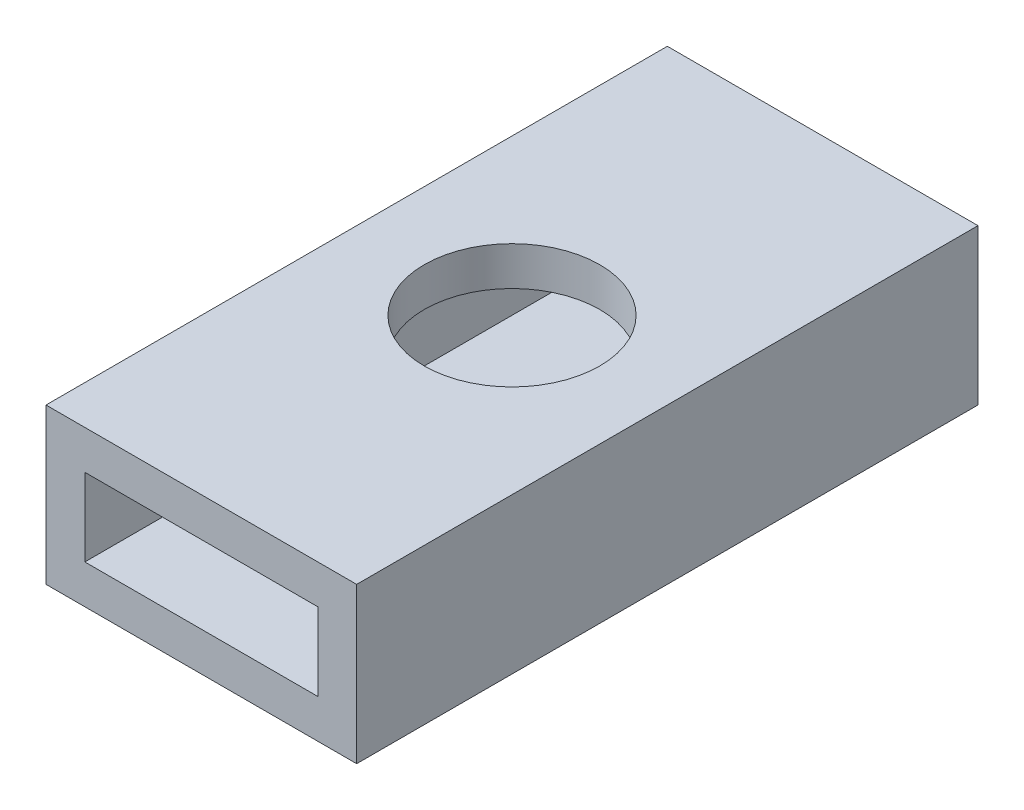
ISO-10303-21;
HEADER;
FILE_DESCRIPTION(('STEP AP214'),'2;1');
FILE_NAME('part.step','',(''),(''),'','','');
FILE_SCHEMA(('AUTOMOTIVE_DESIGN { 1 0 10303 214 1 1 1 1 }'));
ENDSEC;
DATA;
#1=APPLICATION_CONTEXT('core data for automotive mechanical design processes');
#2=APPLICATION_PROTOCOL_DEFINITION('international standard','automotive_design',2000,#1);
#3=PRODUCT_CONTEXT('',#1,'mechanical');
#4=PRODUCT('Part','Part','',(#3));
#5=PRODUCT_RELATED_PRODUCT_CATEGORY('part','',(#4));
#6=PRODUCT_DEFINITION_FORMATION('','',#4);
#7=PRODUCT_DEFINITION_CONTEXT('part definition',#1,'design');
#8=PRODUCT_DEFINITION('design','',#6,#7);
#9=PRODUCT_DEFINITION_SHAPE('','',#8);
#10=(LENGTH_UNIT() NAMED_UNIT(*) SI_UNIT(.MILLI.,.METRE.));
#11=(NAMED_UNIT(*) PLANE_ANGLE_UNIT() SI_UNIT($,.RADIAN.));
#12=(NAMED_UNIT(*) SI_UNIT($,.STERADIAN.) SOLID_ANGLE_UNIT());
#13=UNCERTAINTY_MEASURE_WITH_UNIT(LENGTH_MEASURE(1.E-05),#10,'distance_accuracy_value','');
#14=(GEOMETRIC_REPRESENTATION_CONTEXT(3) GLOBAL_UNCERTAINTY_ASSIGNED_CONTEXT((#13)) GLOBAL_UNIT_ASSIGNED_CONTEXT((#10,
#11,#12)) REPRESENTATION_CONTEXT('',''));
#15=CARTESIAN_POINT('',(0.,0.,0.));
#16=DIRECTION('',(0.,0.,1.));
#17=DIRECTION('',(1.,0.,0.));
#18=AXIS2_PLACEMENT_3D('',#15,#16,#17);
#19=CARTESIAN_POINT('',(0.,0.,101.6));
#20=DIRECTION('',(1.,0.,0.));
#21=DIRECTION('',(0.,1.,0.));
#22=AXIS2_PLACEMENT_3D('',#19,#20,#21);
#23=PLANE('',#22);
#24=DIRECTION('',(0.,-1.,0.));
#25=VECTOR('',#24,1.);
#26=CARTESIAN_POINT('',(0.,0.,0.));
#27=LINE('',#26,#25);
#28=CARTESIAN_POINT('',(0.,25.4,0.));
#29=VERTEX_POINT('',#28);
#30=CARTESIAN_POINT('',(0.,0.,0.));
#31=VERTEX_POINT('',#30);
#32=EDGE_CURVE('E150',#29,#31,#27,.T.);
#33=ORIENTED_EDGE('',*,*,#32,.T.);
#34=DIRECTION('',(0.,0.,-1.));
#35=VECTOR('',#34,1.);
#36=CARTESIAN_POINT('',(0.,0.,101.6));
#37=LINE('',#36,#35);
#38=CARTESIAN_POINT('',(0.,0.,101.6));
#39=VERTEX_POINT('',#38);
#40=EDGE_CURVE('E11',#39,#31,#37,.T.);
#41=ORIENTED_EDGE('',*,*,#40,.F.);
#42=DIRECTION('',(0.,-1.,0.));
#43=VECTOR('',#42,1.);
#44=CARTESIAN_POINT('',(0.,0.,101.6));
#45=LINE('',#44,#43);
#46=CARTESIAN_POINT('',(0.,25.4,101.6));
#47=VERTEX_POINT('',#46);
#48=EDGE_CURVE('E156',#47,#39,#45,.T.);
#49=ORIENTED_EDGE('',*,*,#48,.F.);
#50=DIRECTION('',(0.,0.,-1.));
#51=VECTOR('',#50,1.);
#52=CARTESIAN_POINT('',(0.,25.4,101.6));
#53=LINE('',#52,#51);
#54=EDGE_CURVE('E170',#47,#29,#53,.T.);
#55=ORIENTED_EDGE('',*,*,#54,.T.);
#56=EDGE_LOOP('',(#33,#41,#49,#55));
#57=FACE_BOUND('',#56,.T.);
#58=ADVANCED_FACE('F39',(#57),#23,.F.);
#59=CARTESIAN_POINT('',(0.,0.,101.6));
#60=DIRECTION('',(0.,1.,0.));
#61=DIRECTION('',(0.,0.,1.));
#62=AXIS2_PLACEMENT_3D('',#59,#60,#61);
#63=PLANE('',#62);
#64=DIRECTION('',(1.,0.,0.));
#65=VECTOR('',#64,1.);
#66=CARTESIAN_POINT('',(0.,0.,0.));
#67=LINE('',#66,#65);
#68=CARTESIAN_POINT('',(50.8,0.,0.));
#69=VERTEX_POINT('',#68);
#70=EDGE_CURVE('E174',#31,#69,#67,.T.);
#71=ORIENTED_EDGE('',*,*,#70,.T.);
#72=DIRECTION('',(0.,0.,-1.));
#73=VECTOR('',#72,1.);
#74=CARTESIAN_POINT('',(50.8,0.,101.6));
#75=LINE('',#74,#73);
#76=CARTESIAN_POINT('',(50.8,0.,101.6));
#77=VERTEX_POINT('',#76);
#78=EDGE_CURVE('E47',#77,#69,#75,.T.);
#79=ORIENTED_EDGE('',*,*,#78,.F.);
#80=DIRECTION('',(1.,0.,0.));
#81=VECTOR('',#80,1.);
#82=CARTESIAN_POINT('',(0.,0.,101.6));
#83=LINE('',#82,#81);
#84=EDGE_CURVE('E160',#39,#77,#83,.T.);
#85=ORIENTED_EDGE('',*,*,#84,.F.);
#86=ORIENTED_EDGE('',*,*,#40,.T.);
#87=EDGE_LOOP('',(#71,#79,#85,#86));
#88=FACE_BOUND('',#87,.T.);
#89=ADVANCED_FACE('F208',(#88),#63,.F.);
#90=CARTESIAN_POINT('',(50.8,0.,101.6));
#91=DIRECTION('',(-1.,0.,0.));
#92=DIRECTION('',(0.,-1.,0.));
#93=AXIS2_PLACEMENT_3D('',#90,#91,#92);
#94=PLANE('',#93);
#95=DIRECTION('',(0.,1.,0.));
#96=VECTOR('',#95,1.);
#97=CARTESIAN_POINT('',(50.8,0.,0.));
#98=LINE('',#97,#96);
#99=CARTESIAN_POINT('',(50.8,25.4,0.));
#100=VERTEX_POINT('',#99);
#101=EDGE_CURVE('E177',#69,#100,#98,.T.);
#102=ORIENTED_EDGE('',*,*,#101,.T.);
#103=DIRECTION('',(0.,0.,-1.));
#104=VECTOR('',#103,1.);
#105=CARTESIAN_POINT('',(50.8,25.4,101.6));
#106=LINE('',#105,#104);
#107=CARTESIAN_POINT('',(50.8,25.4,101.6));
#108=VERTEX_POINT('',#107);
#109=EDGE_CURVE('E185',#108,#100,#106,.T.);
#110=ORIENTED_EDGE('',*,*,#109,.F.);
#111=DIRECTION('',(0.,1.,0.));
#112=VECTOR('',#111,1.);
#113=CARTESIAN_POINT('',(50.8,0.,101.6));
#114=LINE('',#113,#112);
#115=EDGE_CURVE('E164',#77,#108,#114,.T.);
#116=ORIENTED_EDGE('',*,*,#115,.F.);
#117=ORIENTED_EDGE('',*,*,#78,.T.);
#118=EDGE_LOOP('',(#102,#110,#116,#117));
#119=FACE_BOUND('',#118,.T.);
#120=ADVANCED_FACE('F194',(#119),#94,.F.);
#121=CARTESIAN_POINT('',(0.,25.4,101.6));
#122=DIRECTION('',(0.,-1.,0.));
#123=DIRECTION('',(0.,0.,-1.));
#124=AXIS2_PLACEMENT_3D('',#121,#122,#123);
#125=PLANE('',#124);
#126=CARTESIAN_POINT('',(25.4,25.4,50.8));
#127=DIRECTION('',(0.,1.,0.));
#128=DIRECTION('',(0.,0.,1.));
#129=AXIS2_PLACEMENT_3D('',#126,#127,#128);
#130=CIRCLE('',#129,14.351);
#131=CARTESIAN_POINT('',(25.4,25.4,65.151));
#132=VERTEX_POINT('',#131);
#133=EDGE_CURVE('E243',#132,#132,#130,.T.);
#134=ORIENTED_EDGE('',*,*,#133,.F.);
#135=EDGE_LOOP('',(#134));
#136=FACE_BOUND('',#135,.T.);
#137=DIRECTION('',(-1.,0.,0.));
#138=VECTOR('',#137,1.);
#139=CARTESIAN_POINT('',(0.,25.4,0.));
#140=LINE('',#139,#138);
#141=EDGE_CURVE('E161',#100,#29,#140,.T.);
#142=ORIENTED_EDGE('',*,*,#141,.T.);
#143=ORIENTED_EDGE('',*,*,#54,.F.);
#144=DIRECTION('',(-1.,0.,0.));
#145=VECTOR('',#144,1.);
#146=CARTESIAN_POINT('',(0.,25.4,101.6));
#147=LINE('',#146,#145);
#148=EDGE_CURVE('E167',#108,#47,#147,.T.);
#149=ORIENTED_EDGE('',*,*,#148,.F.);
#150=ORIENTED_EDGE('',*,*,#109,.T.);
#151=EDGE_LOOP('',(#142,#143,#149,#150));
#152=FACE_BOUND('',#151,.T.);
#153=ADVANCED_FACE('F201',(#136,#152),#125,.F.);
#154=CARTESIAN_POINT('',(0.,0.,101.6));
#155=DIRECTION('',(0.,0.,-1.));
#156=DIRECTION('',(-1.,0.,0.));
#157=AXIS2_PLACEMENT_3D('',#154,#155,#156);
#158=PLANE('',#157);
#159=DIRECTION('',(1.,0.,0.));
#160=VECTOR('',#159,1.);
#161=CARTESIAN_POINT('',(6.35,6.35,101.6));
#162=LINE('',#161,#160);
#163=CARTESIAN_POINT('',(6.35,6.35,101.6));
#164=VERTEX_POINT('',#163);
#165=CARTESIAN_POINT('',(44.45,6.35,101.6));
#166=VERTEX_POINT('',#165);
#167=EDGE_CURVE('E141',#164,#166,#162,.T.);
#168=ORIENTED_EDGE('',*,*,#167,.F.);
#169=DIRECTION('',(0.,-1.,0.));
#170=VECTOR('',#169,1.);
#171=CARTESIAN_POINT('',(6.35,19.05,101.6));
#172=LINE('',#171,#170);
#173=CARTESIAN_POINT('',(6.35,19.05,101.6));
#174=VERTEX_POINT('',#173);
#175=EDGE_CURVE('E54',#174,#164,#172,.T.);
#176=ORIENTED_EDGE('',*,*,#175,.F.);
#177=DIRECTION('',(-1.,0.,0.));
#178=VECTOR('',#177,1.);
#179=CARTESIAN_POINT('',(6.35,19.05,101.6));
#180=LINE('',#179,#178);
#181=CARTESIAN_POINT('',(44.45,19.05,101.6));
#182=VERTEX_POINT('',#181);
#183=EDGE_CURVE('E125',#182,#174,#180,.T.);
#184=ORIENTED_EDGE('',*,*,#183,.F.);
#185=DIRECTION('',(0.,1.,0.));
#186=VECTOR('',#185,1.);
#187=CARTESIAN_POINT('',(44.45,19.05,101.6));
#188=LINE('',#187,#186);
#189=EDGE_CURVE('E129',#166,#182,#188,.T.);
#190=ORIENTED_EDGE('',*,*,#189,.F.);
#191=EDGE_LOOP('',(#168,#176,#184,#190));
#192=FACE_BOUND('',#191,.T.);
#193=ORIENTED_EDGE('',*,*,#48,.T.);
#194=ORIENTED_EDGE('',*,*,#84,.T.);
#195=ORIENTED_EDGE('',*,*,#115,.T.);
#196=ORIENTED_EDGE('',*,*,#148,.T.);
#197=EDGE_LOOP('',(#193,#194,#195,#196));
#198=FACE_BOUND('',#197,.T.);
#199=ADVANCED_FACE('F207',(#192,#198),#158,.F.);
#200=CARTESIAN_POINT('',(0.,0.,0.));
#201=DIRECTION('',(0.,0.,-1.));
#202=DIRECTION('',(-1.,0.,0.));
#203=AXIS2_PLACEMENT_3D('',#200,#201,#202);
#204=PLANE('',#203);
#205=DIRECTION('',(0.,-1.,0.));
#206=VECTOR('',#205,1.);
#207=CARTESIAN_POINT('',(6.35,19.05,0.));
#208=LINE('',#207,#206);
#209=CARTESIAN_POINT('',(6.35,19.05,0.));
#210=VERTEX_POINT('',#209);
#211=CARTESIAN_POINT('',(6.35,6.35,0.));
#212=VERTEX_POINT('',#211);
#213=EDGE_CURVE('E106',#210,#212,#208,.T.);
#214=ORIENTED_EDGE('',*,*,#213,.T.);
#215=DIRECTION('',(1.,0.,0.));
#216=VECTOR('',#215,1.);
#217=CARTESIAN_POINT('',(6.35,6.35,0.));
#218=LINE('',#217,#216);
#219=CARTESIAN_POINT('',(44.45,6.35,0.));
#220=VERTEX_POINT('',#219);
#221=EDGE_CURVE('E116',#212,#220,#218,.T.);
#222=ORIENTED_EDGE('',*,*,#221,.T.);
#223=DIRECTION('',(0.,1.,0.));
#224=VECTOR('',#223,1.);
#225=CARTESIAN_POINT('',(44.45,19.05,0.));
#226=LINE('',#225,#224);
#227=CARTESIAN_POINT('',(44.45,19.05,0.));
#228=VERTEX_POINT('',#227);
#229=EDGE_CURVE('E62',#220,#228,#226,.T.);
#230=ORIENTED_EDGE('',*,*,#229,.T.);
#231=DIRECTION('',(-1.,0.,0.));
#232=VECTOR('',#231,1.);
#233=CARTESIAN_POINT('',(6.35,19.05,0.));
#234=LINE('',#233,#232);
#235=EDGE_CURVE('E113',#228,#210,#234,.T.);
#236=ORIENTED_EDGE('',*,*,#235,.T.);
#237=EDGE_LOOP('',(#214,#222,#230,#236));
#238=FACE_BOUND('',#237,.T.);
#239=ORIENTED_EDGE('',*,*,#32,.F.);
#240=ORIENTED_EDGE('',*,*,#141,.F.);
#241=ORIENTED_EDGE('',*,*,#101,.F.);
#242=ORIENTED_EDGE('',*,*,#70,.F.);
#243=EDGE_LOOP('',(#239,#240,#241,#242));
#244=FACE_BOUND('',#243,.T.);
#245=ADVANCED_FACE('F121',(#238,#244),#204,.T.);
#246=CARTESIAN_POINT('',(6.35,19.05,0.));
#247=DIRECTION('',(-1.,0.,0.));
#248=DIRECTION('',(0.,-1.,0.));
#249=AXIS2_PLACEMENT_3D('',#246,#247,#248);
#250=PLANE('',#249);
#251=ORIENTED_EDGE('',*,*,#175,.T.);
#252=DIRECTION('',(0.,0.,1.));
#253=VECTOR('',#252,1.);
#254=CARTESIAN_POINT('',(6.35,6.35,0.));
#255=LINE('',#254,#253);
#256=EDGE_CURVE('E102',#212,#164,#255,.T.);
#257=ORIENTED_EDGE('',*,*,#256,.F.);
#258=ORIENTED_EDGE('',*,*,#213,.F.);
#259=DIRECTION('',(0.,0.,1.));
#260=VECTOR('',#259,1.);
#261=CARTESIAN_POINT('',(6.35,19.05,0.));
#262=LINE('',#261,#260);
#263=EDGE_CURVE('E147',#210,#174,#262,.T.);
#264=ORIENTED_EDGE('',*,*,#263,.T.);
#265=EDGE_LOOP('',(#251,#257,#258,#264));
#266=FACE_BOUND('',#265,.T.);
#267=ADVANCED_FACE('F104',(#266),#250,.F.);
#268=CARTESIAN_POINT('',(6.35,19.05,0.));
#269=DIRECTION('',(0.,1.,0.));
#270=DIRECTION('',(0.,0.,1.));
#271=AXIS2_PLACEMENT_3D('',#268,#269,#270);
#272=PLANE('',#271);
#273=CARTESIAN_POINT('',(25.4,19.05,50.8));
#274=DIRECTION('',(0.,1.,0.));
#275=DIRECTION('',(0.,0.,1.));
#276=AXIS2_PLACEMENT_3D('',#273,#274,#275);
#277=CIRCLE('',#276,14.351);
#278=CARTESIAN_POINT('',(25.4,19.05,65.151));
#279=VERTEX_POINT('',#278);
#280=EDGE_CURVE('E132',#279,#279,#277,.F.);
#281=ORIENTED_EDGE('',*,*,#280,.F.);
#282=EDGE_LOOP('',(#281));
#283=FACE_BOUND('',#282,.T.);
#284=ORIENTED_EDGE('',*,*,#183,.T.);
#285=ORIENTED_EDGE('',*,*,#263,.F.);
#286=ORIENTED_EDGE('',*,*,#235,.F.);
#287=DIRECTION('',(0.,0.,1.));
#288=VECTOR('',#287,1.);
#289=CARTESIAN_POINT('',(44.45,19.05,0.));
#290=LINE('',#289,#288);
#291=EDGE_CURVE('E151',#228,#182,#290,.T.);
#292=ORIENTED_EDGE('',*,*,#291,.T.);
#293=EDGE_LOOP('',(#284,#285,#286,#292));
#294=FACE_BOUND('',#293,.T.);
#295=ADVANCED_FACE('F226',(#283,#294),#272,.F.);
#296=CARTESIAN_POINT('',(44.45,19.05,0.));
#297=DIRECTION('',(1.,0.,0.));
#298=DIRECTION('',(0.,0.,-1.));
#299=AXIS2_PLACEMENT_3D('',#296,#297,#298);
#300=PLANE('',#299);
#301=ORIENTED_EDGE('',*,*,#189,.T.);
#302=ORIENTED_EDGE('',*,*,#291,.F.);
#303=ORIENTED_EDGE('',*,*,#229,.F.);
#304=DIRECTION('',(0.,0.,1.));
#305=VECTOR('',#304,1.);
#306=CARTESIAN_POINT('',(44.45,6.35,0.));
#307=LINE('',#306,#305);
#308=EDGE_CURVE('E112',#220,#166,#307,.T.);
#309=ORIENTED_EDGE('',*,*,#308,.T.);
#310=EDGE_LOOP('',(#301,#302,#303,#309));
#311=FACE_BOUND('',#310,.T.);
#312=ADVANCED_FACE('F230',(#311),#300,.F.);
#313=CARTESIAN_POINT('',(6.35,6.35,0.));
#314=DIRECTION('',(0.,-1.,0.));
#315=DIRECTION('',(0.,0.,-1.));
#316=AXIS2_PLACEMENT_3D('',#313,#314,#315);
#317=PLANE('',#316);
#318=ORIENTED_EDGE('',*,*,#167,.T.);
#319=ORIENTED_EDGE('',*,*,#308,.F.);
#320=ORIENTED_EDGE('',*,*,#221,.F.);
#321=ORIENTED_EDGE('',*,*,#256,.T.);
#322=EDGE_LOOP('',(#318,#319,#320,#321));
#323=FACE_BOUND('',#322,.T.);
#324=ADVANCED_FACE('F117',(#323),#317,.F.);
#325=CARTESIAN_POINT('',(25.4,-0.001000000000001,50.8));
#326=DIRECTION('',(0.,1.,0.));
#327=DIRECTION('',(0.,0.,1.));
#328=AXIS2_PLACEMENT_3D('',#325,#326,#327);
#329=CYLINDRICAL_SURFACE('',#328,14.351);
#330=CARTESIAN_POINT('',(25.4,25.4,65.151));
#331=CARTESIAN_POINT('',(25.4,25.3338541666667,65.151));
#332=CARTESIAN_POINT('',(25.4,25.2677083333333,65.151));
#333=CARTESIAN_POINT('',(25.4,25.1354166666667,65.151));
#334=CARTESIAN_POINT('',(25.4,25.0692708333333,65.151));
#335=CARTESIAN_POINT('',(25.4,24.9369791666667,65.151));
#336=CARTESIAN_POINT('',(25.4,24.8708333333333,65.151));
#337=CARTESIAN_POINT('',(25.4,24.7385416666667,65.151));
#338=CARTESIAN_POINT('',(25.4,24.6723958333333,65.151));
#339=CARTESIAN_POINT('',(25.4,24.5401041666667,65.151));
#340=CARTESIAN_POINT('',(25.4,24.4739583333333,65.151));
#341=CARTESIAN_POINT('',(25.4,24.3416666666667,65.151));
#342=CARTESIAN_POINT('',(25.4,24.2755208333333,65.151));
#343=CARTESIAN_POINT('',(25.4,24.1432291666667,65.151));
#344=CARTESIAN_POINT('',(25.4,24.0770833333333,65.151));
#345=CARTESIAN_POINT('',(25.4,23.9447916666667,65.151));
#346=CARTESIAN_POINT('',(25.4,23.8786458333333,65.151));
#347=CARTESIAN_POINT('',(25.4,23.7463541666667,65.151));
#348=CARTESIAN_POINT('',(25.4,23.6802083333333,65.151));
#349=CARTESIAN_POINT('',(25.4,23.5479166666667,65.151));
#350=CARTESIAN_POINT('',(25.4,23.4817708333333,65.151));
#351=CARTESIAN_POINT('',(25.4,23.3494791666667,65.151));
#352=CARTESIAN_POINT('',(25.4,23.2833333333333,65.151));
#353=CARTESIAN_POINT('',(25.4,23.1510416666667,65.151));
#354=CARTESIAN_POINT('',(25.4,23.0848958333333,65.151));
#355=CARTESIAN_POINT('',(25.4,22.9526041666667,65.151));
#356=CARTESIAN_POINT('',(25.4,22.8864583333333,65.151));
#357=CARTESIAN_POINT('',(25.4,22.7541666666667,65.151));
#358=CARTESIAN_POINT('',(25.4,22.6880208333333,65.151));
#359=CARTESIAN_POINT('',(25.4,22.5557291666667,65.151));
#360=CARTESIAN_POINT('',(25.4,22.4895833333333,65.151));
#361=CARTESIAN_POINT('',(25.4,22.3572916666667,65.151));
#362=CARTESIAN_POINT('',(25.4,22.2911458333333,65.151));
#363=CARTESIAN_POINT('',(25.4,22.1588541666667,65.151));
#364=CARTESIAN_POINT('',(25.4,22.0927083333333,65.151));
#365=CARTESIAN_POINT('',(25.4,21.9604166666667,65.151));
#366=CARTESIAN_POINT('',(25.4,21.8942708333333,65.151));
#367=CARTESIAN_POINT('',(25.4,21.7619791666667,65.151));
#368=CARTESIAN_POINT('',(25.4,21.6958333333333,65.151));
#369=CARTESIAN_POINT('',(25.4,21.5635416666667,65.151));
#370=CARTESIAN_POINT('',(25.4,21.4973958333333,65.151));
#371=CARTESIAN_POINT('',(25.4,21.3651041666667,65.151));
#372=CARTESIAN_POINT('',(25.4,21.2989583333333,65.151));
#373=CARTESIAN_POINT('',(25.4,21.1666666666667,65.151));
#374=CARTESIAN_POINT('',(25.4,21.1005208333333,65.151));
#375=CARTESIAN_POINT('',(25.4,20.9682291666667,65.151));
#376=CARTESIAN_POINT('',(25.4,20.9020833333333,65.151));
#377=CARTESIAN_POINT('',(25.4,20.7697916666667,65.151));
#378=CARTESIAN_POINT('',(25.4,20.7036458333333,65.151));
#379=CARTESIAN_POINT('',(25.4,20.5713541666667,65.151));
#380=CARTESIAN_POINT('',(25.4,20.5052083333333,65.151));
#381=CARTESIAN_POINT('',(25.4,20.3729166666667,65.151));
#382=CARTESIAN_POINT('',(25.4,20.3067708333333,65.151));
#383=CARTESIAN_POINT('',(25.4,20.1744791666667,65.151));
#384=CARTESIAN_POINT('',(25.4,20.1083333333333,65.151));
#385=CARTESIAN_POINT('',(25.4,19.9760416666667,65.151));
#386=CARTESIAN_POINT('',(25.4,19.9098958333333,65.151));
#387=CARTESIAN_POINT('',(25.4,19.7776041666667,65.151));
#388=CARTESIAN_POINT('',(25.4,19.7114583333333,65.151));
#389=CARTESIAN_POINT('',(25.4,19.5791666666667,65.151));
#390=CARTESIAN_POINT('',(25.4,19.5130208333333,65.151));
#391=CARTESIAN_POINT('',(25.4,19.3807291666667,65.151));
#392=CARTESIAN_POINT('',(25.4,19.3145833333333,65.151));
#393=CARTESIAN_POINT('',(25.4,19.1822916666667,65.151));
#394=CARTESIAN_POINT('',(25.4,19.1161458333333,65.151));
#395=CARTESIAN_POINT('',(25.4,19.05,65.151));
#396=B_SPLINE_CURVE_WITH_KNOTS('',3,(#330,#331,#332,#333,#334,#335,#336,#337,#338,#339,#340,
#341,#342,#343,#344,#345,#346,#347,#348,#349,#350,#351,#352,#353,#354,#355,#356,#357,#358,#359,
#360,#361,#362,#363,#364,#365,#366,#367,#368,#369,#370,#371,#372,#373,#374,#375,#376,#377,#378,
#379,#380,#381,#382,#383,#384,#385,#386,#387,#388,#389,#390,#391,#392,#393,#394,#395),
.UNSPECIFIED.,.F.,.F.,(4,2,2,2,2,2,2,2,2,2,2,2,2,2,2,2,2,2,2,2,2,2,2,2,2,2,2,2,2,2,2,2,4),(0.,
0.198437499999999,0.396875000000001,0.5953125,0.793749999999999,0.992187500000002,1.190625,
1.3890625,1.5875,1.7859375,1.984375,2.1828125,2.38125,2.5796875,2.778125,2.9765625,3.175,
3.3734375,3.571875,3.7703125,3.96875,4.1671875,4.365625,4.5640625,4.7625,4.9609375,5.159375,
5.3578125,5.55625,5.7546875,5.953125,6.1515625,6.35),.UNSPECIFIED.);
#397=EDGE_CURVE('BSEAM229',#132,#279,#396,.T.);
#398=ORIENTED_EDGE('',*,*,#133,.T.);
#399=ORIENTED_EDGE('',*,*,#280,.T.);
#400=ORIENTED_EDGE('',*,*,#397,.T.);
#401=ORIENTED_EDGE('',*,*,#397,.F.);
#402=EDGE_LOOP('',(#398,#400,#399,#401));
#403=FACE_BOUND('',#402,.T.);
#404=ADVANCED_FACE('F229',(#403),#329,.F.);
#405=CLOSED_SHELL('',(#58,#89,#120,#153,#199,#245,#267,#295,#312,#324,#404));
#406=MANIFOLD_SOLID_BREP('B2',#405);
#407=ADVANCED_BREP_SHAPE_REPRESENTATION('',(#18,#406),#14);
#408=SHAPE_DEFINITION_REPRESENTATION(#9,#407);
ENDSEC;
END-ISO-10303-21;
